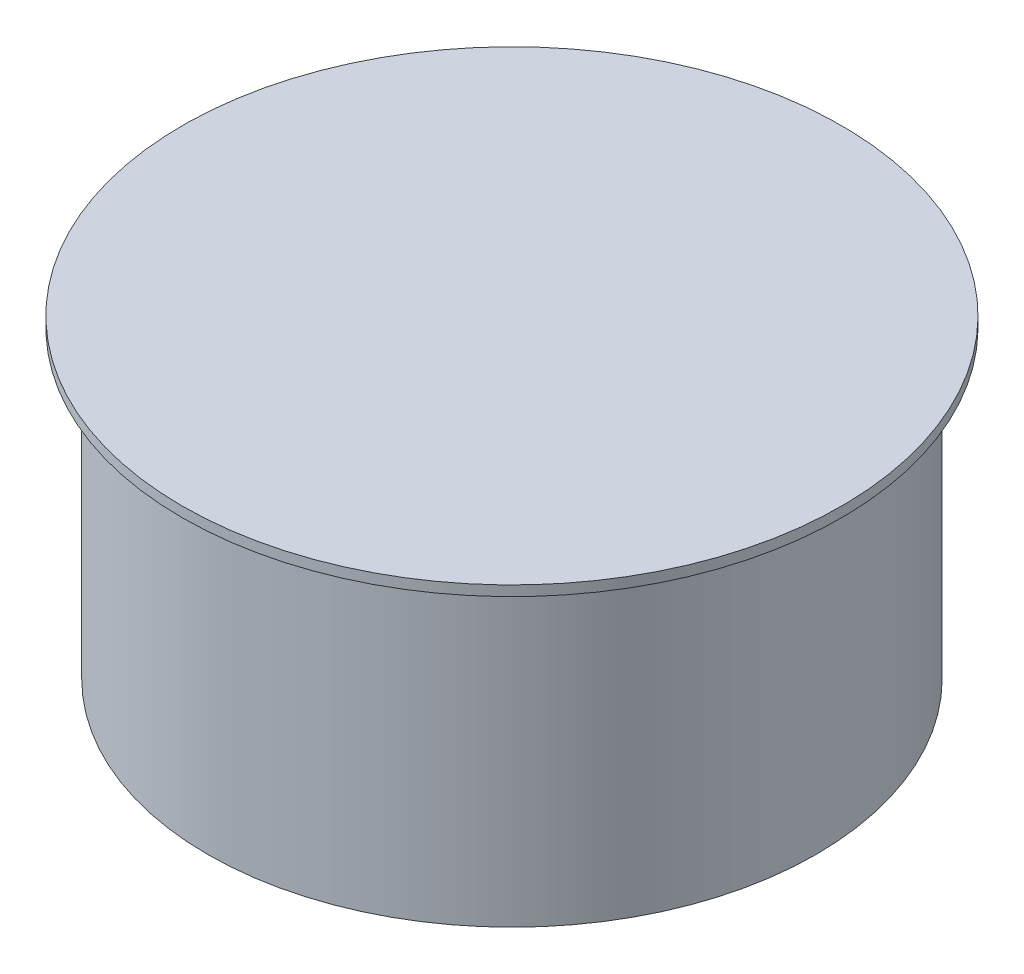
ISO-10303-21;
HEADER;
FILE_DESCRIPTION(('STEP AP214'),'2;1');
FILE_NAME('part.step','',(''),(''),'','','');
FILE_SCHEMA(('AUTOMOTIVE_DESIGN { 1 0 10303 214 1 1 1 1 }'));
ENDSEC;
DATA;
#1=APPLICATION_CONTEXT('core data for automotive mechanical design processes');
#2=APPLICATION_PROTOCOL_DEFINITION('international standard','automotive_design',2000,#1);
#3=PRODUCT_CONTEXT('',#1,'mechanical');
#4=PRODUCT('Part','Part','',(#3));
#5=PRODUCT_RELATED_PRODUCT_CATEGORY('part','',(#4));
#6=PRODUCT_DEFINITION_FORMATION('','',#4);
#7=PRODUCT_DEFINITION_CONTEXT('part definition',#1,'design');
#8=PRODUCT_DEFINITION('design','',#6,#7);
#9=PRODUCT_DEFINITION_SHAPE('','',#8);
#10=(LENGTH_UNIT() NAMED_UNIT(*) SI_UNIT(.MILLI.,.METRE.));
#11=(NAMED_UNIT(*) PLANE_ANGLE_UNIT() SI_UNIT($,.RADIAN.));
#12=(NAMED_UNIT(*) SI_UNIT($,.STERADIAN.) SOLID_ANGLE_UNIT());
#13=UNCERTAINTY_MEASURE_WITH_UNIT(LENGTH_MEASURE(1.E-05),#10,'distance_accuracy_value','');
#14=(GEOMETRIC_REPRESENTATION_CONTEXT(3) GLOBAL_UNCERTAINTY_ASSIGNED_CONTEXT((#13)) GLOBAL_UNIT_ASSIGNED_CONTEXT((#10,
#11,#12)) REPRESENTATION_CONTEXT('',''));
#15=CARTESIAN_POINT('',(0.,0.,0.));
#16=DIRECTION('',(0.,0.,1.));
#17=DIRECTION('',(1.,0.,0.));
#18=AXIS2_PLACEMENT_3D('',#15,#16,#17);
#19=CARTESIAN_POINT('',(0.,152.4,0.));
#20=DIRECTION('',(0.,-1.,0.));
#21=DIRECTION('',(0.,0.,-1.));
#22=AXIS2_PLACEMENT_3D('',#19,#20,#21);
#23=CYLINDRICAL_SURFACE('',#22,152.4);
#24=CARTESIAN_POINT('',(0.,152.4,0.));
#25=DIRECTION('',(0.,1.,0.));
#26=DIRECTION('',(0.,0.,1.));
#27=AXIS2_PLACEMENT_3D('',#24,#25,#26);
#28=CIRCLE('',#27,152.4);
#29=CARTESIAN_POINT('',(0.,152.4,-152.4));
#30=VERTEX_POINT('',#29);
#31=EDGE_CURVE('E10',#30,#30,#28,.T.);
#32=CARTESIAN_POINT('',(0.,0.,0.));
#33=DIRECTION('',(0.,1.,0.));
#34=DIRECTION('',(0.,0.,1.));
#35=AXIS2_PLACEMENT_3D('',#32,#33,#34);
#36=CIRCLE('',#35,152.4);
#37=CARTESIAN_POINT('',(0.,0.,-152.4));
#38=VERTEX_POINT('',#37);
#39=EDGE_CURVE('E33',#38,#38,#36,.T.);
#40=CARTESIAN_POINT('',(0.,152.4,-152.4));
#41=CARTESIAN_POINT('',(0.,150.8125,-152.4));
#42=CARTESIAN_POINT('',(0.,149.225,-152.4));
#43=CARTESIAN_POINT('',(0.,146.05,-152.4));
#44=CARTESIAN_POINT('',(0.,144.4625,-152.4));
#45=CARTESIAN_POINT('',(0.,141.2875,-152.4));
#46=CARTESIAN_POINT('',(0.,139.7,-152.4));
#47=CARTESIAN_POINT('',(0.,136.525,-152.4));
#48=CARTESIAN_POINT('',(0.,134.9375,-152.4));
#49=CARTESIAN_POINT('',(0.,131.7625,-152.4));
#50=CARTESIAN_POINT('',(0.,130.175,-152.4));
#51=CARTESIAN_POINT('',(0.,127.,-152.4));
#52=CARTESIAN_POINT('',(0.,125.4125,-152.4));
#53=CARTESIAN_POINT('',(0.,122.2375,-152.4));
#54=CARTESIAN_POINT('',(0.,120.65,-152.4));
#55=CARTESIAN_POINT('',(0.,117.475,-152.4));
#56=CARTESIAN_POINT('',(0.,115.8875,-152.4));
#57=CARTESIAN_POINT('',(0.,112.7125,-152.4));
#58=CARTESIAN_POINT('',(0.,111.125,-152.4));
#59=CARTESIAN_POINT('',(0.,107.95,-152.4));
#60=CARTESIAN_POINT('',(0.,106.3625,-152.4));
#61=CARTESIAN_POINT('',(0.,103.1875,-152.4));
#62=CARTESIAN_POINT('',(0.,101.6,-152.4));
#63=CARTESIAN_POINT('',(0.,98.425,-152.4));
#64=CARTESIAN_POINT('',(0.,96.8375,-152.4));
#65=CARTESIAN_POINT('',(0.,93.6625,-152.4));
#66=CARTESIAN_POINT('',(0.,92.075,-152.4));
#67=CARTESIAN_POINT('',(0.,88.9,-152.4));
#68=CARTESIAN_POINT('',(0.,87.3125,-152.4));
#69=CARTESIAN_POINT('',(0.,84.1375,-152.4));
#70=CARTESIAN_POINT('',(0.,82.55,-152.4));
#71=CARTESIAN_POINT('',(0.,79.375,-152.4));
#72=CARTESIAN_POINT('',(0.,77.7875,-152.4));
#73=CARTESIAN_POINT('',(0.,74.6125,-152.4));
#74=CARTESIAN_POINT('',(0.,73.025,-152.4));
#75=CARTESIAN_POINT('',(0.,69.85,-152.4));
#76=CARTESIAN_POINT('',(0.,68.2625,-152.4));
#77=CARTESIAN_POINT('',(0.,65.0875,-152.4));
#78=CARTESIAN_POINT('',(0.,63.5,-152.4));
#79=CARTESIAN_POINT('',(0.,60.325,-152.4));
#80=CARTESIAN_POINT('',(0.,58.7375,-152.4));
#81=CARTESIAN_POINT('',(0.,55.5625,-152.4));
#82=CARTESIAN_POINT('',(0.,53.975,-152.4));
#83=CARTESIAN_POINT('',(0.,50.8,-152.4));
#84=CARTESIAN_POINT('',(0.,49.2125,-152.4));
#85=CARTESIAN_POINT('',(0.,46.0375,-152.4));
#86=CARTESIAN_POINT('',(0.,44.45,-152.4));
#87=CARTESIAN_POINT('',(0.,41.275,-152.4));
#88=CARTESIAN_POINT('',(0.,39.6875,-152.4));
#89=CARTESIAN_POINT('',(0.,36.5125,-152.4));
#90=CARTESIAN_POINT('',(0.,34.925,-152.4));
#91=CARTESIAN_POINT('',(0.,31.75,-152.4));
#92=CARTESIAN_POINT('',(0.,30.1625,-152.4));
#93=CARTESIAN_POINT('',(0.,26.9875,-152.4));
#94=CARTESIAN_POINT('',(0.,25.4,-152.4));
#95=CARTESIAN_POINT('',(0.,22.225,-152.4));
#96=CARTESIAN_POINT('',(0.,20.6375,-152.4));
#97=CARTESIAN_POINT('',(0.,17.4625,-152.4));
#98=CARTESIAN_POINT('',(0.,15.875,-152.4));
#99=CARTESIAN_POINT('',(0.,12.7,-152.4));
#100=CARTESIAN_POINT('',(0.,11.1125,-152.4));
#101=CARTESIAN_POINT('',(0.,7.93750000000001,-152.4));
#102=CARTESIAN_POINT('',(0.,6.35,-152.4));
#103=CARTESIAN_POINT('',(0.,3.175,-152.4));
#104=CARTESIAN_POINT('',(0.,1.5875,-152.4));
#105=CARTESIAN_POINT('',(0.,0.,-152.4));
#106=B_SPLINE_CURVE_WITH_KNOTS('',3,(#40,#41,#42,#43,#44,#45,#46,#47,#48,#49,#50,#51,#52,#53,
#54,#55,#56,#57,#58,#59,#60,#61,#62,#63,#64,#65,#66,#67,#68,#69,#70,#71,#72,#73,#74,#75,#76,#77,
#78,#79,#80,#81,#82,#83,#84,#85,#86,#87,#88,#89,#90,#91,#92,#93,#94,#95,#96,#97,#98,#99,#100,
#101,#102,#103,#104,#105),.UNSPECIFIED.,.F.,.F.,(4,2,2,2,2,2,2,2,2,2,2,2,2,2,2,2,2,2,2,2,2,2,2,
2,2,2,2,2,2,2,2,2,4),(0.,4.7625,9.52500000000001,14.2875,19.05,23.8125,28.575,33.3375,38.1,
42.8625,47.625,52.3875,57.15,61.9125,66.675,71.4375,76.2,80.9625,85.725,90.4875,95.25,100.0125,
104.775,109.5375,114.3,119.0625,123.825,128.5875,133.35,138.1125,142.875,147.6375,152.4),.UNSPECIFIED.);
#107=EDGE_CURVE('BSEAM30',#30,#38,#106,.T.);
#108=ORIENTED_EDGE('',*,*,#31,.F.);
#109=ORIENTED_EDGE('',*,*,#39,.T.);
#110=ORIENTED_EDGE('',*,*,#107,.T.);
#111=ORIENTED_EDGE('',*,*,#107,.F.);
#112=EDGE_LOOP('',(#108,#110,#109,#111));
#113=FACE_BOUND('',#112,.T.);
#114=ADVANCED_FACE('F30',(#113),#23,.T.);
#115=CARTESIAN_POINT('',(0.,0.,0.));
#116=DIRECTION('',(0.,1.,0.));
#117=DIRECTION('',(0.,0.,1.));
#118=AXIS2_PLACEMENT_3D('',#115,#116,#117);
#119=PLANE('',#118);
#120=ORIENTED_EDGE('',*,*,#39,.F.);
#121=EDGE_LOOP('',(#120));
#122=FACE_BOUND('',#121,.T.);
#123=ADVANCED_FACE('F58',(#122),#119,.F.);
#124=CARTESIAN_POINT('',(0.,152.4,0.));
#125=DIRECTION('',(0.,1.,0.));
#126=DIRECTION('',(0.,0.,1.));
#127=AXIS2_PLACEMENT_3D('',#124,#125,#126);
#128=PLANE('',#127);
#129=CARTESIAN_POINT('',(0.,152.4,0.));
#130=DIRECTION('',(0.,1.,0.));
#131=DIRECTION('',(0.,0.,1.));
#132=AXIS2_PLACEMENT_3D('',#129,#130,#131);
#133=CIRCLE('',#132,165.1);
#134=CARTESIAN_POINT('',(0.,152.4,165.1));
#135=VERTEX_POINT('',#134);
#136=EDGE_CURVE('E42',#135,#135,#133,.T.);
#137=ORIENTED_EDGE('',*,*,#136,.F.);
#138=EDGE_LOOP('',(#137));
#139=FACE_BOUND('',#138,.T.);
#140=ORIENTED_EDGE('',*,*,#31,.T.);
#141=EDGE_LOOP('',(#140));
#142=FACE_BOUND('',#141,.T.);
#143=ADVANCED_FACE('F53',(#139,#142),#128,.F.);
#144=CARTESIAN_POINT('',(0.,157.48,0.));
#145=DIRECTION('',(0.,-1.,0.));
#146=DIRECTION('',(0.,0.,-1.));
#147=AXIS2_PLACEMENT_3D('',#144,#145,#146);
#148=CYLINDRICAL_SURFACE('',#147,165.1);
#149=CARTESIAN_POINT('',(0.,157.48,0.));
#150=DIRECTION('',(0.,1.,0.));
#151=DIRECTION('',(0.,0.,1.));
#152=AXIS2_PLACEMENT_3D('',#149,#150,#151);
#153=CIRCLE('',#152,165.1);
#154=CARTESIAN_POINT('',(0.,157.48,165.1));
#155=VERTEX_POINT('',#154);
#156=EDGE_CURVE('E40',#155,#155,#153,.T.);
#157=ORIENTED_EDGE('',*,*,#156,.F.);
#158=EDGE_LOOP('',(#157));
#159=FACE_BOUND('',#158,.T.);
#160=ORIENTED_EDGE('',*,*,#136,.T.);
#161=EDGE_LOOP('',(#160));
#162=FACE_BOUND('',#161,.T.);
#163=ADVANCED_FACE('F50',(#159,#162),#148,.T.);
#164=CARTESIAN_POINT('',(0.,157.48,0.));
#165=DIRECTION('',(0.,1.,0.));
#166=DIRECTION('',(0.,0.,1.));
#167=AXIS2_PLACEMENT_3D('',#164,#165,#166);
#168=PLANE('',#167);
#169=ORIENTED_EDGE('',*,*,#156,.T.);
#170=EDGE_LOOP('',(#169));
#171=FACE_BOUND('',#170,.T.);
#172=ADVANCED_FACE('F48',(#171),#168,.T.);
#173=CLOSED_SHELL('',(#114,#123,#143,#163,#172));
#174=MANIFOLD_SOLID_BREP('B2',#173);
#175=ADVANCED_BREP_SHAPE_REPRESENTATION('',(#18,#174),#14);
#176=SHAPE_DEFINITION_REPRESENTATION(#9,#175);
ENDSEC;
END-ISO-10303-21;
